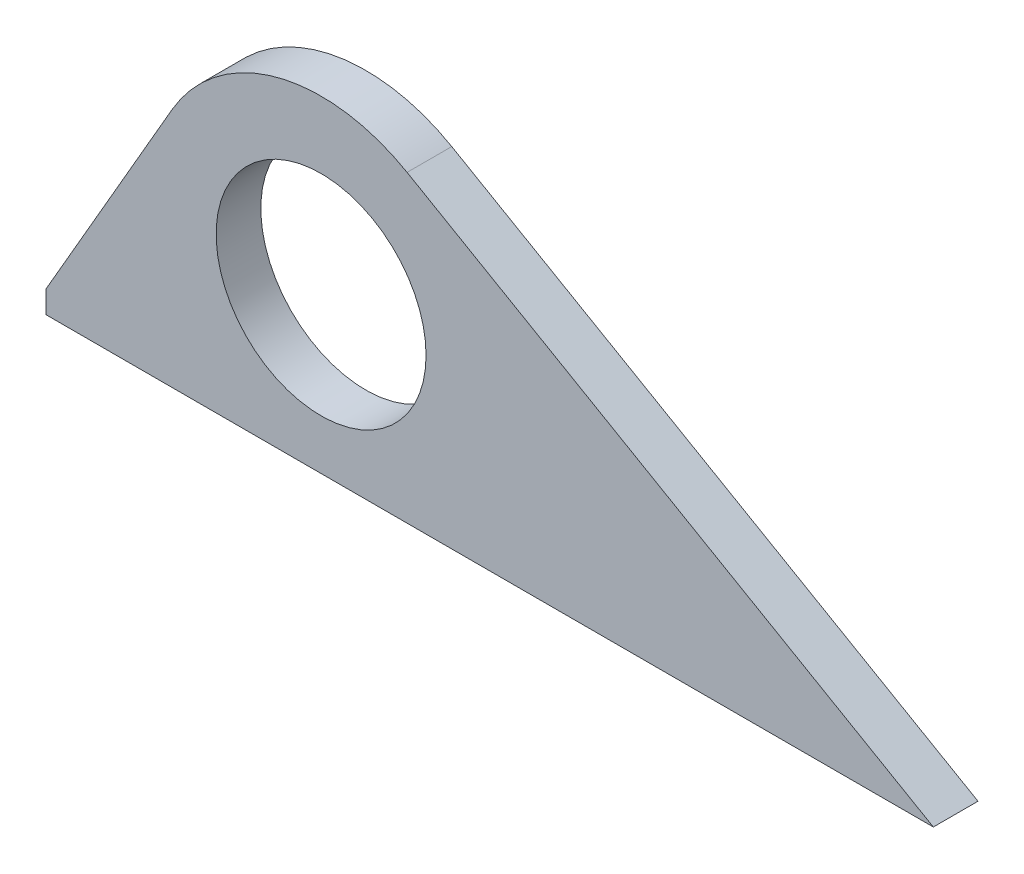
ISO-10303-21;
HEADER;
FILE_DESCRIPTION(('STEP AP214'),'2;1');
FILE_NAME('part.step','',(''),(''),'','','');
FILE_SCHEMA(('AUTOMOTIVE_DESIGN { 1 0 10303 214 1 1 1 1 }'));
ENDSEC;
DATA;
#1=APPLICATION_CONTEXT('core data for automotive mechanical design processes');
#2=APPLICATION_PROTOCOL_DEFINITION('international standard','automotive_design',2000,#1);
#3=PRODUCT_CONTEXT('',#1,'mechanical');
#4=PRODUCT('Part','Part','',(#3));
#5=PRODUCT_RELATED_PRODUCT_CATEGORY('part','',(#4));
#6=PRODUCT_DEFINITION_FORMATION('','',#4);
#7=PRODUCT_DEFINITION_CONTEXT('part definition',#1,'design');
#8=PRODUCT_DEFINITION('design','',#6,#7);
#9=PRODUCT_DEFINITION_SHAPE('','',#8);
#10=(LENGTH_UNIT() NAMED_UNIT(*) SI_UNIT(.MILLI.,.METRE.));
#11=(NAMED_UNIT(*) PLANE_ANGLE_UNIT() SI_UNIT($,.RADIAN.));
#12=(NAMED_UNIT(*) SI_UNIT($,.STERADIAN.) SOLID_ANGLE_UNIT());
#13=UNCERTAINTY_MEASURE_WITH_UNIT(LENGTH_MEASURE(1.E-05),#10,'distance_accuracy_value','');
#14=(GEOMETRIC_REPRESENTATION_CONTEXT(3) GLOBAL_UNCERTAINTY_ASSIGNED_CONTEXT((#13)) GLOBAL_UNIT_ASSIGNED_CONTEXT((#10,
#11,#12)) REPRESENTATION_CONTEXT('',''));
#15=CARTESIAN_POINT('',(0.,0.,0.));
#16=DIRECTION('',(0.,0.,1.));
#17=DIRECTION('',(1.,0.,0.));
#18=AXIS2_PLACEMENT_3D('',#15,#16,#17);
#19=CARTESIAN_POINT('',(61.5919780457002,34.6804353138203,10.));
#20=DIRECTION('',(0.,0.,-1.));
#21=DIRECTION('',(-1.,0.,0.));
#22=AXIS2_PLACEMENT_3D('',#19,#20,#21);
#23=PLANE('',#22);
#24=DIRECTION('',(0.,-1.,0.));
#25=VECTOR('',#24,1.);
#26=CARTESIAN_POINT('',(3.66564762091866E-13,4.99999999999979,10.));
#27=LINE('',#26,#25);
#28=CARTESIAN_POINT('',(3.66564762091866E-13,4.99999999999979,10.));
#29=VERTEX_POINT('',#28);
#30=CARTESIAN_POINT('',(0.,0.,10.));
#31=VERTEX_POINT('',#30);
#32=EDGE_CURVE('E117',#29,#31,#27,.T.);
#33=ORIENTED_EDGE('',*,*,#32,.T.);
#34=DIRECTION('',(1.,0.,0.));
#35=VECTOR('',#34,1.);
#36=CARTESIAN_POINT('',(0.,0.,10.));
#37=LINE('',#36,#35);
#38=CARTESIAN_POINT('',(198.660254037845,0.,10.));
#39=VERTEX_POINT('',#38);
#40=EDGE_CURVE('E84',#31,#39,#37,.T.);
#41=ORIENTED_EDGE('',*,*,#40,.T.);
#42=DIRECTION('',(-0.866025403784442,0.499999999999995,0.));
#43=VECTOR('',#42,1.);
#44=CARTESIAN_POINT('',(198.660254037845,0.,10.));
#45=LINE('',#44,#43);
#46=CARTESIAN_POINT('',(80.8419780457,68.0224133595213,10.));
#47=VERTEX_POINT('',#46);
#48=EDGE_CURVE('E88',#39,#47,#45,.T.);
#49=ORIENTED_EDGE('',*,*,#48,.T.);
#50=CARTESIAN_POINT('',(61.5919780457002,34.6804353138203,10.));
#51=DIRECTION('',(0.,0.,1.));
#52=DIRECTION('',(-1.,0.,0.));
#53=AXIS2_PLACEMENT_3D('',#50,#51,#52);
#54=CIRCLE('',#53,38.5);
#55=CARTESIAN_POINT('',(28.2499999999992,53.9304353138201,10.));
#56=VERTEX_POINT('',#55);
#57=EDGE_CURVE('E92',#47,#56,#54,.T.);
#58=ORIENTED_EDGE('',*,*,#57,.T.);
#59=DIRECTION('',(-0.499999999999988,-0.866025403784445,0.));
#60=VECTOR('',#59,1.);
#61=CARTESIAN_POINT('',(28.2499999999992,53.9304353138201,10.));
#62=LINE('',#61,#60);
#63=EDGE_CURVE('E50',#56,#29,#62,.T.);
#64=ORIENTED_EDGE('',*,*,#63,.T.);
#65=EDGE_LOOP('',(#33,#41,#49,#58,#64));
#66=FACE_BOUND('',#65,.T.);
#67=CARTESIAN_POINT('',(61.5919780457002,34.6804353138203,10.));
#68=DIRECTION('',(0.,0.,1.));
#69=DIRECTION('',(1.,0.,0.));
#70=AXIS2_PLACEMENT_3D('',#67,#68,#69);
#71=CIRCLE('',#70,23.5);
#72=CARTESIAN_POINT('',(85.0919780457002,34.6804353138203,10.));
#73=VERTEX_POINT('',#72);
#74=EDGE_CURVE('E111',#73,#73,#71,.T.);
#75=ORIENTED_EDGE('',*,*,#74,.F.);
#76=EDGE_LOOP('',(#75));
#77=FACE_BOUND('',#76,.T.);
#78=ADVANCED_FACE('F33',(#66,#77),#23,.F.);
#79=CARTESIAN_POINT('',(61.5919780457002,34.6804353138203,0.));
#80=DIRECTION('',(0.,0.,-1.));
#81=DIRECTION('',(-1.,0.,0.));
#82=AXIS2_PLACEMENT_3D('',#79,#80,#81);
#83=PLANE('',#82);
#84=DIRECTION('',(0.,-1.,0.));
#85=VECTOR('',#84,1.);
#86=CARTESIAN_POINT('',(3.66564762091866E-13,4.99999999999979,0.));
#87=LINE('',#86,#85);
#88=CARTESIAN_POINT('',(3.66564762091866E-13,4.99999999999979,0.));
#89=VERTEX_POINT('',#88);
#90=CARTESIAN_POINT('',(0.,0.,0.));
#91=VERTEX_POINT('',#90);
#92=EDGE_CURVE('E107',#89,#91,#87,.T.);
#93=ORIENTED_EDGE('',*,*,#92,.F.);
#94=DIRECTION('',(-0.499999999999988,-0.866025403784445,0.));
#95=VECTOR('',#94,1.);
#96=CARTESIAN_POINT('',(28.2499999999992,53.9304353138201,0.));
#97=LINE('',#96,#95);
#98=CARTESIAN_POINT('',(28.2499999999992,53.9304353138201,0.));
#99=VERTEX_POINT('',#98);
#100=EDGE_CURVE('E76',#99,#89,#97,.T.);
#101=ORIENTED_EDGE('',*,*,#100,.F.);
#102=CARTESIAN_POINT('',(61.5919780457002,34.6804353138203,0.));
#103=DIRECTION('',(0.,0.,1.));
#104=DIRECTION('',(-1.,0.,0.));
#105=AXIS2_PLACEMENT_3D('',#102,#103,#104);
#106=CIRCLE('',#105,38.5);
#107=CARTESIAN_POINT('',(80.8419780457,68.0224133595213,0.));
#108=VERTEX_POINT('',#107);
#109=EDGE_CURVE('E70',#108,#99,#106,.T.);
#110=ORIENTED_EDGE('',*,*,#109,.F.);
#111=DIRECTION('',(-0.866025403784442,0.499999999999994,0.));
#112=VECTOR('',#111,1.);
#113=CARTESIAN_POINT('',(190.,5.,0.));
#114=LINE('',#113,#112);
#115=CARTESIAN_POINT('',(198.660254037845,0.,0.));
#116=VERTEX_POINT('',#115);
#117=EDGE_CURVE('E98',#116,#108,#114,.T.);
#118=ORIENTED_EDGE('',*,*,#117,.F.);
#119=DIRECTION('',(1.,0.,0.));
#120=VECTOR('',#119,1.);
#121=CARTESIAN_POINT('',(190.,0.,0.));
#122=LINE('',#121,#120);
#123=EDGE_CURVE('E110',#91,#116,#122,.T.);
#124=ORIENTED_EDGE('',*,*,#123,.F.);
#125=EDGE_LOOP('',(#93,#101,#110,#118,#124));
#126=FACE_BOUND('',#125,.T.);
#127=CARTESIAN_POINT('',(61.5919780457002,34.6804353138203,0.));
#128=DIRECTION('',(0.,0.,1.));
#129=DIRECTION('',(1.,0.,0.));
#130=AXIS2_PLACEMENT_3D('',#127,#128,#129);
#131=CIRCLE('',#130,23.5);
#132=CARTESIAN_POINT('',(85.0919780457002,34.6804353138203,0.));
#133=VERTEX_POINT('',#132);
#134=EDGE_CURVE('E203',#133,#133,#131,.T.);
#135=ORIENTED_EDGE('',*,*,#134,.T.);
#136=EDGE_LOOP('',(#135));
#137=FACE_BOUND('',#136,.T.);
#138=ADVANCED_FACE('F123',(#126,#137),#83,.T.);
#139=CARTESIAN_POINT('',(3.66564762091866E-13,4.99999999999979,10.));
#140=DIRECTION('',(1.,0.,0.));
#141=DIRECTION('',(0.,1.,0.));
#142=AXIS2_PLACEMENT_3D('',#139,#140,#141);
#143=PLANE('',#142);
#144=ORIENTED_EDGE('',*,*,#92,.T.);
#145=DIRECTION('',(0.,0.,-1.));
#146=VECTOR('',#145,1.);
#147=CARTESIAN_POINT('',(0.,0.,10.));
#148=LINE('',#147,#146);
#149=EDGE_CURVE('E11',#31,#91,#148,.T.);
#150=ORIENTED_EDGE('',*,*,#149,.F.);
#151=ORIENTED_EDGE('',*,*,#32,.F.);
#152=DIRECTION('',(0.,0.,-1.));
#153=VECTOR('',#152,1.);
#154=CARTESIAN_POINT('',(3.66564762091866E-13,4.99999999999979,10.));
#155=LINE('',#154,#153);
#156=EDGE_CURVE('E103',#29,#89,#155,.T.);
#157=ORIENTED_EDGE('',*,*,#156,.T.);
#158=EDGE_LOOP('',(#144,#150,#151,#157));
#159=FACE_BOUND('',#158,.T.);
#160=ADVANCED_FACE('F35',(#159),#143,.F.);
#161=CARTESIAN_POINT('',(190.,0.,10.));
#162=DIRECTION('',(0.,1.,0.));
#163=DIRECTION('',(0.,0.,1.));
#164=AXIS2_PLACEMENT_3D('',#161,#162,#163);
#165=PLANE('',#164);
#166=ORIENTED_EDGE('',*,*,#123,.T.);
#167=DIRECTION('',(0.,0.,-1.));
#168=VECTOR('',#167,1.);
#169=CARTESIAN_POINT('',(198.660254037845,0.,10.));
#170=LINE('',#169,#168);
#171=EDGE_CURVE('E42',#39,#116,#170,.T.);
#172=ORIENTED_EDGE('',*,*,#171,.F.);
#173=ORIENTED_EDGE('',*,*,#40,.F.);
#174=ORIENTED_EDGE('',*,*,#149,.T.);
#175=EDGE_LOOP('',(#166,#172,#173,#174));
#176=FACE_BOUND('',#175,.T.);
#177=ADVANCED_FACE('F119',(#176),#165,.F.);
#178=CARTESIAN_POINT('',(190.,5.,10.));
#179=DIRECTION('',(-0.499999999999994,-0.866025403784442,0.));
#180=DIRECTION('',(0.866025403784442,-0.499999999999994,0.));
#181=AXIS2_PLACEMENT_3D('',#178,#179,#180);
#182=PLANE('',#181);
#183=ORIENTED_EDGE('',*,*,#117,.T.);
#184=DIRECTION('',(0.,0.,-1.));
#185=VECTOR('',#184,1.);
#186=CARTESIAN_POINT('',(80.8419780457,68.0224133595213,10.));
#187=LINE('',#186,#185);
#188=EDGE_CURVE('E96',#47,#108,#187,.T.);
#189=ORIENTED_EDGE('',*,*,#188,.F.);
#190=ORIENTED_EDGE('',*,*,#48,.F.);
#191=ORIENTED_EDGE('',*,*,#171,.T.);
#192=EDGE_LOOP('',(#183,#189,#190,#191));
#193=FACE_BOUND('',#192,.T.);
#194=ADVANCED_FACE('F97',(#193),#182,.F.);
#195=CARTESIAN_POINT('',(61.5919780457002,34.6804353138203,10.));
#196=DIRECTION('',(0.,0.,-1.));
#197=DIRECTION('',(-1.,0.,0.));
#198=AXIS2_PLACEMENT_3D('',#195,#196,#197);
#199=CYLINDRICAL_SURFACE('',#198,38.5);
#200=ORIENTED_EDGE('',*,*,#109,.T.);
#201=DIRECTION('',(0.,0.,-1.));
#202=VECTOR('',#201,1.);
#203=CARTESIAN_POINT('',(28.2499999999992,53.9304353138201,10.));
#204=LINE('',#203,#202);
#205=EDGE_CURVE('E99',#56,#99,#204,.T.);
#206=ORIENTED_EDGE('',*,*,#205,.F.);
#207=ORIENTED_EDGE('',*,*,#57,.F.);
#208=ORIENTED_EDGE('',*,*,#188,.T.);
#209=EDGE_LOOP('',(#200,#206,#207,#208));
#210=FACE_BOUND('',#209,.T.);
#211=ADVANCED_FACE('F101',(#210),#199,.T.);
#212=CARTESIAN_POINT('',(28.2499999999992,53.9304353138201,10.));
#213=DIRECTION('',(0.866025403784445,-0.499999999999988,0.));
#214=DIRECTION('',(0.499999999999988,0.866025403784446,0.));
#215=AXIS2_PLACEMENT_3D('',#212,#213,#214);
#216=PLANE('',#215);
#217=ORIENTED_EDGE('',*,*,#100,.T.);
#218=ORIENTED_EDGE('',*,*,#156,.F.);
#219=ORIENTED_EDGE('',*,*,#63,.F.);
#220=ORIENTED_EDGE('',*,*,#205,.T.);
#221=EDGE_LOOP('',(#217,#218,#219,#220));
#222=FACE_BOUND('',#221,.T.);
#223=ADVANCED_FACE('F127',(#222),#216,.F.);
#224=CARTESIAN_POINT('',(61.5919780457002,34.6804353138203,10.));
#225=DIRECTION('',(0.,0.,-1.));
#226=DIRECTION('',(-1.,0.,0.));
#227=AXIS2_PLACEMENT_3D('',#224,#225,#226);
#228=CYLINDRICAL_SURFACE('',#227,23.5);
#229=ORIENTED_EDGE('',*,*,#74,.T.);
#230=EDGE_LOOP('',(#229));
#231=FACE_BOUND('',#230,.T.);
#232=ORIENTED_EDGE('',*,*,#134,.F.);
#233=EDGE_LOOP('',(#232));
#234=FACE_BOUND('',#233,.T.);
#235=ADVANCED_FACE('F129',(#231,#234),#228,.F.);
#236=CLOSED_SHELL('',(#78,#138,#160,#177,#194,#211,#223,#235));
#237=MANIFOLD_SOLID_BREP('B2',#236);
#238=ADVANCED_BREP_SHAPE_REPRESENTATION('',(#18,#237),#14);
#239=SHAPE_DEFINITION_REPRESENTATION(#9,#238);
ENDSEC;
END-ISO-10303-21;
